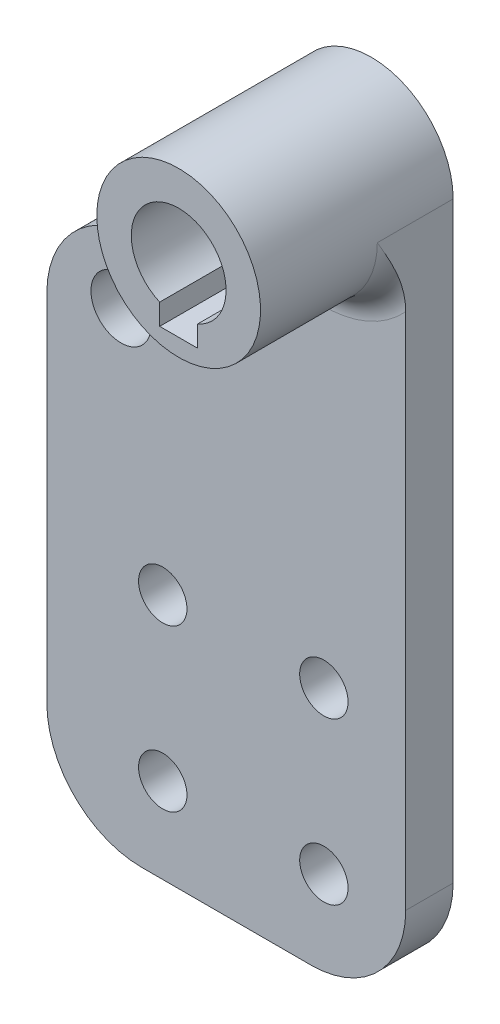
ISO-10303-21;
HEADER;
FILE_DESCRIPTION(('STEP AP214'),'2;1');
FILE_NAME('part.step','',(''),(''),'','','');
FILE_SCHEMA(('AUTOMOTIVE_DESIGN { 1 0 10303 214 1 1 1 1 }'));
ENDSEC;
DATA;
#1=APPLICATION_CONTEXT('core data for automotive mechanical design processes');
#2=APPLICATION_PROTOCOL_DEFINITION('international standard','automotive_design',2000,#1);
#3=PRODUCT_CONTEXT('',#1,'mechanical');
#4=PRODUCT('Part','Part','',(#3));
#5=PRODUCT_RELATED_PRODUCT_CATEGORY('part','',(#4));
#6=PRODUCT_DEFINITION_FORMATION('','',#4);
#7=PRODUCT_DEFINITION_CONTEXT('part definition',#1,'design');
#8=PRODUCT_DEFINITION('design','',#6,#7);
#9=PRODUCT_DEFINITION_SHAPE('','',#8);
#10=(LENGTH_UNIT() NAMED_UNIT(*) SI_UNIT(.MILLI.,.METRE.));
#11=(NAMED_UNIT(*) PLANE_ANGLE_UNIT() SI_UNIT($,.RADIAN.));
#12=(NAMED_UNIT(*) SI_UNIT($,.STERADIAN.) SOLID_ANGLE_UNIT());
#13=UNCERTAINTY_MEASURE_WITH_UNIT(LENGTH_MEASURE(1.E-05),#10,'distance_accuracy_value','');
#14=(GEOMETRIC_REPRESENTATION_CONTEXT(3) GLOBAL_UNCERTAINTY_ASSIGNED_CONTEXT((#13)) GLOBAL_UNIT_ASSIGNED_CONTEXT((#10,
#11,#12)) REPRESENTATION_CONTEXT('',''));
#15=CARTESIAN_POINT('',(0.,0.,0.));
#16=DIRECTION('',(0.,0.,1.));
#17=DIRECTION('',(1.,0.,0.));
#18=AXIS2_PLACEMENT_3D('',#15,#16,#17);
#19=CARTESIAN_POINT('',(-8.636,0.,-5.));
#20=DIRECTION('',(-1.,0.,0.));
#21=DIRECTION('',(0.,-1.,0.));
#22=AXIS2_PLACEMENT_3D('',#19,#20,#21);
#23=PLANE('',#22);
#24=DIRECTION('',(0.,-1.,0.));
#25=VECTOR('',#24,1.);
#26=CARTESIAN_POINT('',(-8.636,0.,-5.));
#27=LINE('',#26,#25);
#28=CARTESIAN_POINT('',(-8.636,0.,-5.));
#29=VERTEX_POINT('',#28);
#30=CARTESIAN_POINT('',(-8.636,-3.0273079091981,-5.));
#31=VERTEX_POINT('',#30);
#32=EDGE_CURVE('E205',#29,#31,#27,.T.);
#33=ORIENTED_EDGE('',*,*,#32,.T.);
#34=DIRECTION('',(0.,0.,1.));
#35=VECTOR('',#34,1.);
#36=CARTESIAN_POINT('',(-8.636,-3.0273079091981,-5.));
#37=LINE('',#36,#35);
#38=CARTESIAN_POINT('',(-8.636,-3.02730790919712,1.31894693533558));
#39=VERTEX_POINT('',#38);
#40=EDGE_CURVE('E304',#31,#39,#37,.T.);
#41=ORIENTED_EDGE('',*,*,#40,.T.);
#42=CARTESIAN_POINT('',(-8.636,-7.79846138670956,0.));
#43=CARTESIAN_POINT('',(-8.636,-7.68803290559079,3.496623452732E-06));
#44=CARTESIAN_POINT('',(-8.636,-7.57763296305611,0.00273825140363565));
#45=CARTESIAN_POINT('',(-8.636,-7.35711345915804,0.0133068635690326));
#46=CARTESIAN_POINT('',(-8.636,-7.24699381312745,0.0211389344820135));
#47=CARTESIAN_POINT('',(-8.636,-6.91776084465362,0.0516942592653301));
#48=CARTESIAN_POINT('',(-8.636,-6.69928284717616,0.0814798956054964));
#49=CARTESIAN_POINT('',(-8.636,-6.26844308966725,0.156703959217849));
#50=CARTESIAN_POINT('',(-8.636,-6.05603863345846,0.201905768123116));
#51=CARTESIAN_POINT('',(-8.636,-5.63447035283438,0.30583223029938));
#52=CARTESIAN_POINT('',(-8.636,-5.42530845727249,0.364564625952009));
#53=CARTESIAN_POINT('',(-8.636,-4.98768936449728,0.500654370668705));
#54=CARTESIAN_POINT('',(-8.636,-4.75965239042602,0.57935231142795));
#55=CARTESIAN_POINT('',(-8.636,-4.30795897403336,0.748524678717429));
#56=CARTESIAN_POINT('',(-8.636,-4.08430390071072,0.839002720172859));
#57=CARTESIAN_POINT('',(-8.636,-3.41921081985177,1.12497394654814));
#58=CARTESIAN_POINT('',(-8.636,-2.98399632606661,1.33488793982071));
#59=CARTESIAN_POINT('',(-8.636,-2.12328463049726,1.77982984912275));
#60=CARTESIAN_POINT('',(-8.636,-1.69787325232018,2.01501829438944));
#61=CARTESIAN_POINT('',(-8.636,-0.85362645777241,2.49697092229878));
#62=CARTESIAN_POINT('',(-8.636,-0.434792614578694,2.74373781958202));
#63=CARTESIAN_POINT('',(-8.636,-0.010674546716334,2.99370850774192));
#64=CARTESIAN_POINT('',(-8.636,-0.00533727245051437,2.99685425506038));
#65=CARTESIAN_POINT('',(-8.636,0.,3.));
#66=B_SPLINE_CURVE_WITH_KNOTS('',3,(#42,#43,#44,#45,#46,#47,#48,#49,#50,#51,#52,#53,#54,#55,#56,
#57,#58,#59,#60,#61,#62,#63,#64,#65),.UNSPECIFIED.,.F.,.F.,(4,2,2,2,2,2,2,2,2,2,2,4),(0.,
0.33120468942966,0.66229336298546,1.32300402431883,1.97399880271087,2.62536701829968,
3.34867354903378,4.07220256419407,5.52036657074905,6.97834303257521,8.43666305108041,
8.45524906732918),.UNSPECIFIED.);
#67=CARTESIAN_POINT('',(-8.636,0.,3.));
#68=VERTEX_POINT('',#67);
#69=EDGE_CURVE('E227',#39,#68,#66,.T.);
#70=ORIENTED_EDGE('',*,*,#69,.T.);
#71=DIRECTION('',(0.,0.,1.));
#72=VECTOR('',#71,1.);
#73=CARTESIAN_POINT('',(-8.636,0.,-5.));
#74=LINE('',#73,#72);
#75=EDGE_CURVE('E212',#29,#68,#74,.T.);
#76=ORIENTED_EDGE('',*,*,#75,.F.);
#77=EDGE_LOOP('',(#33,#41,#70,#76));
#78=FACE_BOUND('',#77,.T.);
#79=ADVANCED_FACE('F64',(#78),#23,.T.);
#80=CARTESIAN_POINT('',(0.,0.,20.));
#81=DIRECTION('',(0.,0.,-1.));
#82=DIRECTION('',(-1.,0.,0.));
#83=AXIS2_PLACEMENT_3D('',#80,#81,#82);
#84=CYLINDRICAL_SURFACE('',#83,8.636);
#85=CARTESIAN_POINT('',(0.,0.,15.32));
#86=DIRECTION('',(0.,0.,-1.));
#87=DIRECTION('',(-1.,0.,0.));
#88=AXIS2_PLACEMENT_3D('',#85,#86,#87);
#89=CIRCLE('',#88,8.636);
#90=CARTESIAN_POINT('',(-8.636,0.,15.32));
#91=VERTEX_POINT('',#90);
#92=EDGE_CURVE('E188',#91,#91,#89,.T.);
#93=ORIENTED_EDGE('',*,*,#92,.T.);
#94=EDGE_LOOP('',(#93));
#95=FACE_BOUND('',#94,.T.);
#96=ORIENTED_EDGE('',*,*,#75,.T.);
#97=CARTESIAN_POINT('',(0.,0.,3.));
#98=DIRECTION('',(0.,0.,1.));
#99=DIRECTION('',(1.,0.,0.));
#100=AXIS2_PLACEMENT_3D('',#97,#98,#99);
#101=CIRCLE('',#100,8.636);
#102=CARTESIAN_POINT('',(8.636,0.,3.));
#103=VERTEX_POINT('',#102);
#104=EDGE_CURVE('E224',#68,#103,#101,.T.);
#105=ORIENTED_EDGE('',*,*,#104,.T.);
#106=DIRECTION('',(0.,0.,1.));
#107=VECTOR('',#106,1.);
#108=CARTESIAN_POINT('',(8.636,0.,-5.));
#109=LINE('',#108,#107);
#110=CARTESIAN_POINT('',(8.636,0.,-5.));
#111=VERTEX_POINT('',#110);
#112=EDGE_CURVE('E216',#111,#103,#109,.T.);
#113=ORIENTED_EDGE('',*,*,#112,.F.);
#114=CARTESIAN_POINT('',(0.,0.,-5.));
#115=DIRECTION('',(0.,0.,1.));
#116=DIRECTION('',(1.,0.,0.));
#117=AXIS2_PLACEMENT_3D('',#114,#115,#116);
#118=CIRCLE('',#117,8.636);
#119=EDGE_CURVE('E204',#111,#29,#118,.T.);
#120=ORIENTED_EDGE('',*,*,#119,.T.);
#121=EDGE_LOOP('',(#96,#105,#113,#120));
#122=FACE_BOUND('',#121,.T.);
#123=ADVANCED_FACE('F249',(#95,#122),#84,.T.);
#124=CARTESIAN_POINT('',(0.,0.,20.));
#125=DIRECTION('',(0.,0.,-1.));
#126=DIRECTION('',(-1.,0.,0.));
#127=AXIS2_PLACEMENT_3D('',#124,#125,#126);
#128=CYLINDRICAL_SURFACE('',#127,5.);
#129=DIRECTION('',(0.,0.,-1.));
#130=VECTOR('',#129,1.);
#131=CARTESIAN_POINT('',(2.,-4.58257569495584,20.));
#132=LINE('',#131,#130);
#133=CARTESIAN_POINT('',(2.,-4.58257569495584,-5.));
#134=VERTEX_POINT('',#133);
#135=CARTESIAN_POINT('',(2.,-4.58257569495584,15.32));
#136=VERTEX_POINT('',#135);
#137=EDGE_CURVE('E201',#134,#136,#132,.F.);
#138=ORIENTED_EDGE('',*,*,#137,.T.);
#139=CARTESIAN_POINT('',(0.,0.,15.32));
#140=DIRECTION('',(0.,0.,-1.));
#141=DIRECTION('',(-1.,0.,0.));
#142=AXIS2_PLACEMENT_3D('',#139,#140,#141);
#143=CIRCLE('',#142,5.);
#144=CARTESIAN_POINT('',(-2.,-4.58257569495584,15.32));
#145=VERTEX_POINT('',#144);
#146=EDGE_CURVE('E419',#136,#145,#143,.F.);
#147=ORIENTED_EDGE('',*,*,#146,.T.);
#148=DIRECTION('',(0.,0.,-1.));
#149=VECTOR('',#148,1.);
#150=CARTESIAN_POINT('',(-2.,-4.58257569495584,20.));
#151=LINE('',#150,#149);
#152=CARTESIAN_POINT('',(-2.,-4.58257569495584,-5.));
#153=VERTEX_POINT('',#152);
#154=EDGE_CURVE('E187',#153,#145,#151,.F.);
#155=ORIENTED_EDGE('',*,*,#154,.F.);
#156=CARTESIAN_POINT('',(0.,0.,-5.));
#157=DIRECTION('',(0.,0.,1.));
#158=DIRECTION('',(1.,0.,0.));
#159=AXIS2_PLACEMENT_3D('',#156,#157,#158);
#160=CIRCLE('',#159,5.);
#161=EDGE_CURVE('E215',#134,#153,#160,.T.);
#162=ORIENTED_EDGE('',*,*,#161,.F.);
#163=EDGE_LOOP('',(#138,#147,#155,#162));
#164=FACE_BOUND('',#163,.T.);
#165=ADVANCED_FACE('F254',(#164),#128,.F.);
#166=CARTESIAN_POINT('',(8.636,0.,-5.));
#167=DIRECTION('',(-1.,0.,0.));
#168=DIRECTION('',(0.,-1.,0.));
#169=AXIS2_PLACEMENT_3D('',#166,#167,#168);
#170=PLANE('',#169);
#171=DIRECTION('',(0.,-1.,0.));
#172=VECTOR('',#171,1.);
#173=CARTESIAN_POINT('',(8.636,0.,0.));
#174=LINE('',#173,#172);
#175=CARTESIAN_POINT('',(8.636,-7.79846138670956,0.));
#176=VERTEX_POINT('',#175);
#177=CARTESIAN_POINT('',(8.63600000000001,-62.5,0.));
#178=VERTEX_POINT('',#177);
#179=EDGE_CURVE('E209',#176,#178,#174,.T.);
#180=ORIENTED_EDGE('',*,*,#179,.T.);
#181=DIRECTION('',(0.,0.,1.));
#182=VECTOR('',#181,1.);
#183=CARTESIAN_POINT('',(8.63600000000001,-62.5,-5.));
#184=LINE('',#183,#182);
#185=CARTESIAN_POINT('',(8.63600000000001,-62.5,-5.));
#186=VERTEX_POINT('',#185);
#187=EDGE_CURVE('E296',#178,#186,#184,.F.);
#188=ORIENTED_EDGE('',*,*,#187,.T.);
#189=DIRECTION('',(0.,-1.,0.));
#190=VECTOR('',#189,1.);
#191=CARTESIAN_POINT('',(8.636,0.,-5.));
#192=LINE('',#191,#190);
#193=EDGE_CURVE('E208',#111,#186,#192,.T.);
#194=ORIENTED_EDGE('',*,*,#193,.F.);
#195=ORIENTED_EDGE('',*,*,#112,.T.);
#196=CARTESIAN_POINT('',(8.636,-7.79846138670956,0.));
#197=CARTESIAN_POINT('',(8.636,-7.68803290559079,3.496623452732E-06));
#198=CARTESIAN_POINT('',(8.636,-7.57763296305611,0.00273825140363565));
#199=CARTESIAN_POINT('',(8.636,-7.35711345915804,0.0133068635690326));
#200=CARTESIAN_POINT('',(8.636,-7.24699381312745,0.0211389344820135));
#201=CARTESIAN_POINT('',(8.636,-6.91776084465362,0.0516942592653301));
#202=CARTESIAN_POINT('',(8.636,-6.69928284717616,0.0814798956054964));
#203=CARTESIAN_POINT('',(8.636,-6.26844308966725,0.156703959217849));
#204=CARTESIAN_POINT('',(8.636,-6.05603863345846,0.201905768123116));
#205=CARTESIAN_POINT('',(8.636,-5.63447035283438,0.30583223029938));
#206=CARTESIAN_POINT('',(8.636,-5.42530845727249,0.364564625952009));
#207=CARTESIAN_POINT('',(8.636,-4.98768936449728,0.500654370668705));
#208=CARTESIAN_POINT('',(8.636,-4.75965239042602,0.57935231142795));
#209=CARTESIAN_POINT('',(8.636,-4.30795897403336,0.748524678717429));
#210=CARTESIAN_POINT('',(8.636,-4.08430390071072,0.839002720172859));
#211=CARTESIAN_POINT('',(8.636,-3.41921081985177,1.12497394654814));
#212=CARTESIAN_POINT('',(8.636,-2.98399632606661,1.33488793982071));
#213=CARTESIAN_POINT('',(8.636,-2.12328463049726,1.77982984912275));
#214=CARTESIAN_POINT('',(8.636,-1.69787325232018,2.01501829438944));
#215=CARTESIAN_POINT('',(8.636,-0.85362645777241,2.49697092229878));
#216=CARTESIAN_POINT('',(8.636,-0.434792614578694,2.74373781958202));
#217=CARTESIAN_POINT('',(8.636,-0.010674546716334,2.99370850774192));
#218=CARTESIAN_POINT('',(8.636,-0.00533727245051437,2.99685425506038));
#219=CARTESIAN_POINT('',(8.636,0.,3.));
#220=B_SPLINE_CURVE_WITH_KNOTS('',3,(#196,#197,#198,#199,#200,#201,#202,#203,#204,#205,#206,
#207,#208,#209,#210,#211,#212,#213,#214,#215,#216,#217,#218,#219),.UNSPECIFIED.,.F.,.F.,(4,2,2,
2,2,2,2,2,2,2,2,4),(0.,0.33120468942966,0.66229336298546,1.32300402431883,1.97399880271087,
2.62536701829968,3.34867354903378,4.07220256419407,5.52036657074905,6.97834303257521,
8.43666305108041,8.45524906732918),.UNSPECIFIED.);
#221=EDGE_CURVE('E235',#103,#176,#220,.F.);
#222=ORIENTED_EDGE('',*,*,#221,.T.);
#223=EDGE_LOOP('',(#180,#188,#194,#195,#222));
#224=FACE_BOUND('',#223,.T.);
#225=ADVANCED_FACE('F251',(#224),#170,.F.);
#226=CARTESIAN_POINT('',(0.,0.,-5.));
#227=DIRECTION('',(0.,0.,1.));
#228=DIRECTION('',(1.,0.,0.));
#229=AXIS2_PLACEMENT_3D('',#226,#227,#228);
#230=PLANE('',#229);
#231=CARTESIAN_POINT('',(-21.4,-22.5,-5.));
#232=DIRECTION('',(0.,0.,1.));
#233=DIRECTION('',(1.,0.,0.));
#234=AXIS2_PLACEMENT_3D('',#231,#232,#233);
#235=CIRCLE('',#234,3.175);
#236=CARTESIAN_POINT('',(-18.225,-22.5,-5.));
#237=VERTEX_POINT('',#236);
#238=EDGE_CURVE('E385',#237,#237,#235,.F.);
#239=ORIENTED_EDGE('',*,*,#238,.F.);
#240=EDGE_LOOP('',(#239));
#241=FACE_BOUND('',#240,.T.);
#242=CARTESIAN_POINT('',(-17.,-46.5,-5.));
#243=DIRECTION('',(0.,0.,1.));
#244=DIRECTION('',(1.,0.,0.));
#245=AXIS2_PLACEMENT_3D('',#242,#243,#244);
#246=CIRCLE('',#245,2.5527);
#247=CARTESIAN_POINT('',(-14.4473,-46.5,-5.));
#248=VERTEX_POINT('',#247);
#249=EDGE_CURVE('E393',#248,#248,#246,.T.);
#250=ORIENTED_EDGE('',*,*,#249,.T.);
#251=EDGE_LOOP('',(#250));
#252=FACE_BOUND('',#251,.T.);
#253=CARTESIAN_POINT('',(0.,-46.5,-5.));
#254=DIRECTION('',(0.,0.,1.));
#255=DIRECTION('',(1.,0.,0.));
#256=AXIS2_PLACEMENT_3D('',#253,#254,#255);
#257=CIRCLE('',#256,2.5527);
#258=CARTESIAN_POINT('',(2.55270000000001,-46.5,-5.));
#259=VERTEX_POINT('',#258);
#260=EDGE_CURVE('E399',#259,#259,#257,.T.);
#261=ORIENTED_EDGE('',*,*,#260,.T.);
#262=EDGE_LOOP('',(#261));
#263=FACE_BOUND('',#262,.T.);
#264=CARTESIAN_POINT('',(-17.,-63.5,-5.));
#265=DIRECTION('',(0.,0.,1.));
#266=DIRECTION('',(1.,0.,0.));
#267=AXIS2_PLACEMENT_3D('',#264,#265,#266);
#268=CIRCLE('',#267,2.5527);
#269=CARTESIAN_POINT('',(-14.4473,-63.5,-5.));
#270=VERTEX_POINT('',#269);
#271=EDGE_CURVE('E405',#270,#270,#268,.T.);
#272=ORIENTED_EDGE('',*,*,#271,.T.);
#273=EDGE_LOOP('',(#272));
#274=FACE_BOUND('',#273,.T.);
#275=CARTESIAN_POINT('',(0.,-63.5,-5.));
#276=DIRECTION('',(0.,0.,1.));
#277=DIRECTION('',(1.,0.,0.));
#278=AXIS2_PLACEMENT_3D('',#275,#276,#277);
#279=CIRCLE('',#278,2.5527);
#280=CARTESIAN_POINT('',(2.55270000000001,-63.5,-5.));
#281=VERTEX_POINT('',#280);
#282=EDGE_CURVE('E411',#281,#281,#279,.T.);
#283=ORIENTED_EDGE('',*,*,#282,.T.);
#284=EDGE_LOOP('',(#283));
#285=FACE_BOUND('',#284,.T.);
#286=DIRECTION('',(-1.,0.,0.));
#287=VECTOR('',#286,1.);
#288=CARTESIAN_POINT('',(0.,-6.79999999999994,-5.));
#289=LINE('',#288,#287);
#290=CARTESIAN_POINT('',(2.,-6.79999999999993,-5.));
#291=VERTEX_POINT('',#290);
#292=CARTESIAN_POINT('',(-1.99999999999999,-6.79999999999994,-5.));
#293=VERTEX_POINT('',#292);
#294=EDGE_CURVE('E192',#291,#293,#289,.T.);
#295=ORIENTED_EDGE('',*,*,#294,.F.);
#296=DIRECTION('',(0.,1.,0.));
#297=VECTOR('',#296,1.);
#298=CARTESIAN_POINT('',(2.,0.,-5.));
#299=LINE('',#298,#297);
#300=EDGE_CURVE('E414',#291,#134,#299,.T.);
#301=ORIENTED_EDGE('',*,*,#300,.T.);
#302=ORIENTED_EDGE('',*,*,#161,.T.);
#303=DIRECTION('',(0.,1.,0.));
#304=VECTOR('',#303,1.);
#305=CARTESIAN_POINT('',(-2.,0.,-5.));
#306=LINE('',#305,#304);
#307=EDGE_CURVE('E197',#293,#153,#306,.T.);
#308=ORIENTED_EDGE('',*,*,#307,.F.);
#309=EDGE_LOOP('',(#295,#301,#302,#308));
#310=FACE_BOUND('',#309,.T.);
#311=DIRECTION('',(0.,1.,0.));
#312=VECTOR('',#311,1.);
#313=CARTESIAN_POINT('',(-29.2250526436834,0.,-5.));
#314=LINE('',#313,#312);
#315=CARTESIAN_POINT('',(-29.2250526436834,-62.5,-5.));
#316=VERTEX_POINT('',#315);
#317=CARTESIAN_POINT('',(-29.2250526436834,-25.,-5.));
#318=VERTEX_POINT('',#317);
#319=EDGE_CURVE('E383',#316,#318,#314,.T.);
#320=ORIENTED_EDGE('',*,*,#319,.T.);
#321=CARTESIAN_POINT('',(-19.2250526436834,-25.,-5.));
#322=DIRECTION('',(0.,0.,1.));
#323=DIRECTION('',(1.,0.,0.));
#324=AXIS2_PLACEMENT_3D('',#321,#322,#323);
#325=CIRCLE('',#324,10.);
#326=CARTESIAN_POINT('',(-20.2110469517617,-15.0487279594799,-5.));
#327=VERTEX_POINT('',#326);
#328=EDGE_CURVE('E288',#318,#327,#325,.F.);
#329=ORIENTED_EDGE('',*,*,#328,.T.);
#330=CARTESIAN_POINT('',(-20.680626740984,-10.3094346501822,-5.));
#331=DIRECTION('',(0.,0.,1.));
#332=DIRECTION('',(1.,0.,0.));
#333=AXIS2_PLACEMENT_3D('',#330,#331,#332);
#334=CIRCLE('',#333,4.7625);
#335=CARTESIAN_POINT('',(-17.3130306955831,-13.6770306955831,-5.));
#336=VERTEX_POINT('',#335);
#337=EDGE_CURVE('E354',#327,#336,#334,.T.);
#338=ORIENTED_EDGE('',*,*,#337,.T.);
#339=DIRECTION('',(0.707106781186544,0.707106781186551,0.));
#340=VECTOR('',#339,1.);
#341=CARTESIAN_POINT('',(-1.81800000000007,1.81800000000005,-5.));
#342=LINE('',#341,#340);
#343=CARTESIAN_POINT('',(-10.030903954599,-6.39490395459902,-5.));
#344=VERTEX_POINT('',#343);
#345=EDGE_CURVE('E301',#336,#344,#342,.T.);
#346=ORIENTED_EDGE('',*,*,#345,.T.);
#347=CARTESIAN_POINT('',(-13.3985,-3.0273079091981,-5.));
#348=DIRECTION('',(0.,0.,1.));
#349=DIRECTION('',(1.,0.,0.));
#350=AXIS2_PLACEMENT_3D('',#347,#348,#349);
#351=CIRCLE('',#350,4.7625);
#352=EDGE_CURVE('E357',#344,#31,#351,.T.);
#353=ORIENTED_EDGE('',*,*,#352,.T.);
#354=ORIENTED_EDGE('',*,*,#32,.F.);
#355=ORIENTED_EDGE('',*,*,#119,.F.);
#356=ORIENTED_EDGE('',*,*,#193,.T.);
#357=CARTESIAN_POINT('',(-1.36399999999999,-62.5,-5.));
#358=DIRECTION('',(0.,0.,1.));
#359=DIRECTION('',(1.,0.,0.));
#360=AXIS2_PLACEMENT_3D('',#357,#358,#359);
#361=CIRCLE('',#360,10.);
#362=CARTESIAN_POINT('',(-1.36399999999999,-72.5,-5.));
#363=VERTEX_POINT('',#362);
#364=EDGE_CURVE('E284',#186,#363,#361,.F.);
#365=ORIENTED_EDGE('',*,*,#364,.T.);
#366=DIRECTION('',(1.,0.,0.));
#367=VECTOR('',#366,1.);
#368=CARTESIAN_POINT('',(0.,-72.5,-5.));
#369=LINE('',#368,#367);
#370=CARTESIAN_POINT('',(-19.2250526436834,-72.5,-5.));
#371=VERTEX_POINT('',#370);
#372=EDGE_CURVE('E374',#371,#363,#369,.T.);
#373=ORIENTED_EDGE('',*,*,#372,.F.);
#374=CARTESIAN_POINT('',(-19.2250526436834,-62.5,-5.));
#375=DIRECTION('',(0.,0.,1.));
#376=DIRECTION('',(1.,0.,0.));
#377=AXIS2_PLACEMENT_3D('',#374,#375,#376);
#378=CIRCLE('',#377,10.);
#379=EDGE_CURVE('E286',#371,#316,#378,.F.);
#380=ORIENTED_EDGE('',*,*,#379,.T.);
#381=EDGE_LOOP('',(#320,#329,#338,#346,#353,#354,#355,#356,#365,#373,#380));
#382=FACE_BOUND('',#381,.T.);
#383=ADVANCED_FACE('F367',(#241,#252,#263,#274,#285,#310,#382),#230,.F.);
#384=CARTESIAN_POINT('',(0.,0.,0.));
#385=DIRECTION('',(0.,0.,1.));
#386=DIRECTION('',(1.,0.,0.));
#387=AXIS2_PLACEMENT_3D('',#384,#385,#386);
#388=PLANE('',#387);
#389=CARTESIAN_POINT('',(-21.4,-22.5,0.));
#390=DIRECTION('',(0.,0.,1.));
#391=DIRECTION('',(1.,0.,0.));
#392=AXIS2_PLACEMENT_3D('',#389,#390,#391);
#393=CIRCLE('',#392,3.175);
#394=CARTESIAN_POINT('',(-18.225,-22.5,0.));
#395=VERTEX_POINT('',#394);
#396=EDGE_CURVE('E424',#395,#395,#393,.T.);
#397=ORIENTED_EDGE('',*,*,#396,.F.);
#398=EDGE_LOOP('',(#397));
#399=FACE_BOUND('',#398,.T.);
#400=DIRECTION('',(-0.707106781186544,-0.707106781186551,0.));
#401=VECTOR('',#400,1.);
#402=CARTESIAN_POINT('',(-8.636,-4.99999999999995,0.));
#403=LINE('',#402,#401);
#404=CARTESIAN_POINT('',(-10.030903954599,-6.39490395459902,0.));
#405=VERTEX_POINT('',#404);
#406=CARTESIAN_POINT('',(-17.3130306955831,-13.6770306955831,0.));
#407=VERTEX_POINT('',#406);
#408=EDGE_CURVE('E298',#405,#407,#403,.T.);
#409=ORIENTED_EDGE('',*,*,#408,.T.);
#410=CARTESIAN_POINT('',(-20.680626740984,-10.3094346501822,0.));
#411=DIRECTION('',(0.,0.,1.));
#412=DIRECTION('',(1.,0.,0.));
#413=AXIS2_PLACEMENT_3D('',#410,#411,#412);
#414=CIRCLE('',#413,4.7625);
#415=CARTESIAN_POINT('',(-20.2110469517617,-15.0487279594799,0.));
#416=VERTEX_POINT('',#415);
#417=EDGE_CURVE('E72',#407,#416,#414,.F.);
#418=ORIENTED_EDGE('',*,*,#417,.T.);
#419=CARTESIAN_POINT('',(-19.2250526436834,-25.,0.));
#420=DIRECTION('',(0.,0.,1.));
#421=DIRECTION('',(1.,0.,0.));
#422=AXIS2_PLACEMENT_3D('',#419,#420,#421);
#423=CIRCLE('',#422,10.);
#424=CARTESIAN_POINT('',(-29.2250526436834,-25.,0.));
#425=VERTEX_POINT('',#424);
#426=EDGE_CURVE('E275',#416,#425,#423,.T.);
#427=ORIENTED_EDGE('',*,*,#426,.T.);
#428=DIRECTION('',(0.,-1.,0.));
#429=VECTOR('',#428,1.);
#430=CARTESIAN_POINT('',(-29.2250526436834,0.,0.));
#431=LINE('',#430,#429);
#432=CARTESIAN_POINT('',(-29.2250526436834,-62.5,0.));
#433=VERTEX_POINT('',#432);
#434=EDGE_CURVE('E380',#425,#433,#431,.T.);
#435=ORIENTED_EDGE('',*,*,#434,.T.);
#436=CARTESIAN_POINT('',(-19.2250526436834,-62.5,0.));
#437=DIRECTION('',(0.,0.,1.));
#438=DIRECTION('',(1.,0.,0.));
#439=AXIS2_PLACEMENT_3D('',#436,#437,#438);
#440=CIRCLE('',#439,10.);
#441=CARTESIAN_POINT('',(-19.2250526436834,-72.5,0.));
#442=VERTEX_POINT('',#441);
#443=EDGE_CURVE('E273',#433,#442,#440,.T.);
#444=ORIENTED_EDGE('',*,*,#443,.T.);
#445=DIRECTION('',(-1.,0.,0.));
#446=VECTOR('',#445,1.);
#447=CARTESIAN_POINT('',(0.,-72.5,0.));
#448=LINE('',#447,#446);
#449=CARTESIAN_POINT('',(-1.36399999999999,-72.5,0.));
#450=VERTEX_POINT('',#449);
#451=EDGE_CURVE('E381',#450,#442,#448,.T.);
#452=ORIENTED_EDGE('',*,*,#451,.F.);
#453=CARTESIAN_POINT('',(-1.36399999999999,-62.5,0.));
#454=DIRECTION('',(0.,0.,1.));
#455=DIRECTION('',(1.,0.,0.));
#456=AXIS2_PLACEMENT_3D('',#453,#454,#455);
#457=CIRCLE('',#456,10.);
#458=EDGE_CURVE('E272',#450,#178,#457,.T.);
#459=ORIENTED_EDGE('',*,*,#458,.T.);
#460=ORIENTED_EDGE('',*,*,#179,.F.);
#461=CARTESIAN_POINT('',(0.,0.,0.));
#462=DIRECTION('',(0.,0.,1.));
#463=DIRECTION('',(1.,0.,0.));
#464=AXIS2_PLACEMENT_3D('',#461,#462,#463);
#465=CIRCLE('',#464,11.636);
#466=CARTESIAN_POINT('',(-9.84666146176818,-6.19998016588193,0.));
#467=VERTEX_POINT('',#466);
#468=EDGE_CURVE('E86',#176,#467,#465,.F.);
#469=ORIENTED_EDGE('',*,*,#468,.T.);
#470=CARTESIAN_POINT('',(-13.3985,-3.0273079091981,0.));
#471=DIRECTION('',(0.,0.,1.));
#472=DIRECTION('',(1.,0.,0.));
#473=AXIS2_PLACEMENT_3D('',#470,#471,#472);
#474=CIRCLE('',#473,4.7625);
#475=EDGE_CURVE('E320',#467,#405,#474,.F.);
#476=ORIENTED_EDGE('',*,*,#475,.T.);
#477=EDGE_LOOP('',(#409,#418,#427,#435,#444,#452,#459,#460,#469,#476));
#478=FACE_BOUND('',#477,.T.);
#479=CARTESIAN_POINT('',(-17.,-46.5,0.));
#480=DIRECTION('',(0.,0.,1.));
#481=DIRECTION('',(1.,0.,0.));
#482=AXIS2_PLACEMENT_3D('',#479,#480,#481);
#483=CIRCLE('',#482,2.5527);
#484=CARTESIAN_POINT('',(-14.4473,-46.5,0.));
#485=VERTEX_POINT('',#484);
#486=EDGE_CURVE('E390',#485,#485,#483,.T.);
#487=ORIENTED_EDGE('',*,*,#486,.F.);
#488=EDGE_LOOP('',(#487));
#489=FACE_BOUND('',#488,.T.);
#490=CARTESIAN_POINT('',(0.,-46.5,0.));
#491=DIRECTION('',(0.,0.,1.));
#492=DIRECTION('',(1.,0.,0.));
#493=AXIS2_PLACEMENT_3D('',#490,#491,#492);
#494=CIRCLE('',#493,2.5527);
#495=CARTESIAN_POINT('',(2.55270000000001,-46.5,0.));
#496=VERTEX_POINT('',#495);
#497=EDGE_CURVE('E396',#496,#496,#494,.T.);
#498=ORIENTED_EDGE('',*,*,#497,.F.);
#499=EDGE_LOOP('',(#498));
#500=FACE_BOUND('',#499,.T.);
#501=CARTESIAN_POINT('',(-17.,-63.5,0.));
#502=DIRECTION('',(0.,0.,1.));
#503=DIRECTION('',(1.,0.,0.));
#504=AXIS2_PLACEMENT_3D('',#501,#502,#503);
#505=CIRCLE('',#504,2.5527);
#506=CARTESIAN_POINT('',(-14.4473,-63.5,0.));
#507=VERTEX_POINT('',#506);
#508=EDGE_CURVE('E402',#507,#507,#505,.T.);
#509=ORIENTED_EDGE('',*,*,#508,.F.);
#510=EDGE_LOOP('',(#509));
#511=FACE_BOUND('',#510,.T.);
#512=CARTESIAN_POINT('',(0.,-63.5,0.));
#513=DIRECTION('',(0.,0.,1.));
#514=DIRECTION('',(1.,0.,0.));
#515=AXIS2_PLACEMENT_3D('',#512,#513,#514);
#516=CIRCLE('',#515,2.5527);
#517=CARTESIAN_POINT('',(2.55270000000001,-63.5,0.));
#518=VERTEX_POINT('',#517);
#519=EDGE_CURVE('E408',#518,#518,#516,.T.);
#520=ORIENTED_EDGE('',*,*,#519,.F.);
#521=EDGE_LOOP('',(#520));
#522=FACE_BOUND('',#521,.T.);
#523=ADVANCED_FACE('F362',(#399,#478,#489,#500,#511,#522),#388,.T.);
#524=CARTESIAN_POINT('',(2.,0.,-5.));
#525=DIRECTION('',(1.,0.,0.));
#526=DIRECTION('',(0.,1.,0.));
#527=AXIS2_PLACEMENT_3D('',#524,#525,#526);
#528=PLANE('',#527);
#529=DIRECTION('',(0.,0.,1.));
#530=VECTOR('',#529,1.);
#531=CARTESIAN_POINT('',(2.,-6.79999999999993,-5.));
#532=LINE('',#531,#530);
#533=CARTESIAN_POINT('',(2.,-6.79999999999993,15.32));
#534=VERTEX_POINT('',#533);
#535=EDGE_CURVE('E194',#291,#534,#532,.T.);
#536=ORIENTED_EDGE('',*,*,#535,.T.);
#537=DIRECTION('',(0.,1.,0.));
#538=VECTOR('',#537,1.);
#539=CARTESIAN_POINT('',(2.,0.,15.32));
#540=LINE('',#539,#538);
#541=EDGE_CURVE('E78',#534,#136,#540,.T.);
#542=ORIENTED_EDGE('',*,*,#541,.T.);
#543=ORIENTED_EDGE('',*,*,#137,.F.);
#544=ORIENTED_EDGE('',*,*,#300,.F.);
#545=EDGE_LOOP('',(#536,#542,#543,#544));
#546=FACE_BOUND('',#545,.T.);
#547=ADVANCED_FACE('F422',(#546),#528,.F.);
#548=CARTESIAN_POINT('',(-2.,0.,-5.));
#549=DIRECTION('',(1.,0.,0.));
#550=DIRECTION('',(0.,1.,0.));
#551=AXIS2_PLACEMENT_3D('',#548,#549,#550);
#552=PLANE('',#551);
#553=DIRECTION('',(0.,1.,0.));
#554=VECTOR('',#553,1.);
#555=CARTESIAN_POINT('',(-2.,0.,15.32));
#556=LINE('',#555,#554);
#557=CARTESIAN_POINT('',(-2.,-6.79999999999994,15.32));
#558=VERTEX_POINT('',#557);
#559=EDGE_CURVE('E176',#558,#145,#556,.T.);
#560=ORIENTED_EDGE('',*,*,#559,.F.);
#561=DIRECTION('',(0.,0.,1.));
#562=VECTOR('',#561,1.);
#563=CARTESIAN_POINT('',(-2.,-6.79999999999994,-5.));
#564=LINE('',#563,#562);
#565=EDGE_CURVE('E184',#293,#558,#564,.T.);
#566=ORIENTED_EDGE('',*,*,#565,.F.);
#567=ORIENTED_EDGE('',*,*,#307,.T.);
#568=ORIENTED_EDGE('',*,*,#154,.T.);
#569=EDGE_LOOP('',(#560,#566,#567,#568));
#570=FACE_BOUND('',#569,.T.);
#571=ADVANCED_FACE('F183',(#570),#552,.T.);
#572=CARTESIAN_POINT('',(0.,-6.79999999999994,-5.));
#573=DIRECTION('',(0.,1.,0.));
#574=DIRECTION('',(-1.,0.,0.));
#575=AXIS2_PLACEMENT_3D('',#572,#573,#574);
#576=PLANE('',#575);
#577=DIRECTION('',(-1.,0.,0.));
#578=VECTOR('',#577,1.);
#579=CARTESIAN_POINT('',(0.,-6.79999999999994,15.32));
#580=LINE('',#579,#578);
#581=EDGE_CURVE('E12',#534,#558,#580,.T.);
#582=ORIENTED_EDGE('',*,*,#581,.F.);
#583=ORIENTED_EDGE('',*,*,#535,.F.);
#584=ORIENTED_EDGE('',*,*,#294,.T.);
#585=ORIENTED_EDGE('',*,*,#565,.T.);
#586=EDGE_LOOP('',(#582,#583,#584,#585));
#587=FACE_BOUND('',#586,.T.);
#588=ADVANCED_FACE('F190',(#587),#576,.T.);
#589=CARTESIAN_POINT('',(0.,-63.5,0.));
#590=DIRECTION('',(0.,0.,1.));
#591=DIRECTION('',(1.,0.,0.));
#592=AXIS2_PLACEMENT_3D('',#589,#590,#591);
#593=CYLINDRICAL_SURFACE('',#592,2.5527);
#594=ORIENTED_EDGE('',*,*,#282,.F.);
#595=EDGE_LOOP('',(#594));
#596=FACE_BOUND('',#595,.T.);
#597=ORIENTED_EDGE('',*,*,#519,.T.);
#598=EDGE_LOOP('',(#597));
#599=FACE_BOUND('',#598,.T.);
#600=ADVANCED_FACE('F446',(#596,#599),#593,.F.);
#601=CARTESIAN_POINT('',(-17.,-63.5,0.));
#602=DIRECTION('',(0.,0.,1.));
#603=DIRECTION('',(1.,0.,0.));
#604=AXIS2_PLACEMENT_3D('',#601,#602,#603);
#605=CYLINDRICAL_SURFACE('',#604,2.5527);
#606=ORIENTED_EDGE('',*,*,#271,.F.);
#607=EDGE_LOOP('',(#606));
#608=FACE_BOUND('',#607,.T.);
#609=ORIENTED_EDGE('',*,*,#508,.T.);
#610=EDGE_LOOP('',(#609));
#611=FACE_BOUND('',#610,.T.);
#612=ADVANCED_FACE('F449',(#608,#611),#605,.F.);
#613=CARTESIAN_POINT('',(0.,-46.5,0.));
#614=DIRECTION('',(0.,0.,1.));
#615=DIRECTION('',(1.,0.,0.));
#616=AXIS2_PLACEMENT_3D('',#613,#614,#615);
#617=CYLINDRICAL_SURFACE('',#616,2.5527);
#618=ORIENTED_EDGE('',*,*,#260,.F.);
#619=EDGE_LOOP('',(#618));
#620=FACE_BOUND('',#619,.T.);
#621=ORIENTED_EDGE('',*,*,#497,.T.);
#622=EDGE_LOOP('',(#621));
#623=FACE_BOUND('',#622,.T.);
#624=ADVANCED_FACE('F453',(#620,#623),#617,.F.);
#625=CARTESIAN_POINT('',(-17.,-46.5,0.));
#626=DIRECTION('',(0.,0.,1.));
#627=DIRECTION('',(1.,0.,0.));
#628=AXIS2_PLACEMENT_3D('',#625,#626,#627);
#629=CYLINDRICAL_SURFACE('',#628,2.5527);
#630=ORIENTED_EDGE('',*,*,#249,.F.);
#631=EDGE_LOOP('',(#630));
#632=FACE_BOUND('',#631,.T.);
#633=ORIENTED_EDGE('',*,*,#486,.T.);
#634=EDGE_LOOP('',(#633));
#635=FACE_BOUND('',#634,.T.);
#636=ADVANCED_FACE('F457',(#632,#635),#629,.F.);
#637=CARTESIAN_POINT('',(-29.2250526436834,0.,-65.2597503268464));
#638=DIRECTION('',(-1.,0.,0.));
#639=DIRECTION('',(0.,0.,1.));
#640=AXIS2_PLACEMENT_3D('',#637,#638,#639);
#641=PLANE('',#640);
#642=ORIENTED_EDGE('',*,*,#434,.F.);
#643=DIRECTION('',(0.,0.,1.));
#644=VECTOR('',#643,1.);
#645=CARTESIAN_POINT('',(-29.2250526436834,-25.,-5.));
#646=LINE('',#645,#644);
#647=EDGE_CURVE('E282',#425,#318,#646,.F.);
#648=ORIENTED_EDGE('',*,*,#647,.T.);
#649=ORIENTED_EDGE('',*,*,#319,.F.);
#650=DIRECTION('',(0.,0.,1.));
#651=VECTOR('',#650,1.);
#652=CARTESIAN_POINT('',(-29.2250526436834,-62.5,0.));
#653=LINE('',#652,#651);
#654=EDGE_CURVE('E279',#316,#433,#653,.T.);
#655=ORIENTED_EDGE('',*,*,#654,.T.);
#656=EDGE_LOOP('',(#642,#648,#649,#655));
#657=FACE_BOUND('',#656,.T.);
#658=ADVANCED_FACE('F461',(#657),#641,.T.);
#659=CARTESIAN_POINT('',(0.,-72.5,-84.9643100801743));
#660=DIRECTION('',(0.,1.,0.));
#661=DIRECTION('',(0.,0.,1.));
#662=AXIS2_PLACEMENT_3D('',#659,#660,#661);
#663=PLANE('',#662);
#664=ORIENTED_EDGE('',*,*,#451,.T.);
#665=DIRECTION('',(0.,0.,1.));
#666=VECTOR('',#665,1.);
#667=CARTESIAN_POINT('',(-19.2250526436834,-72.5,-5.));
#668=LINE('',#667,#666);
#669=EDGE_CURVE('E294',#442,#371,#668,.F.);
#670=ORIENTED_EDGE('',*,*,#669,.T.);
#671=ORIENTED_EDGE('',*,*,#372,.T.);
#672=DIRECTION('',(0.,0.,1.));
#673=VECTOR('',#672,1.);
#674=CARTESIAN_POINT('',(-1.36399999999999,-72.5,-84.9643100801743));
#675=LINE('',#674,#673);
#676=EDGE_CURVE('E291',#363,#450,#675,.T.);
#677=ORIENTED_EDGE('',*,*,#676,.T.);
#678=EDGE_LOOP('',(#664,#670,#671,#677));
#679=FACE_BOUND('',#678,.T.);
#680=ADVANCED_FACE('F378',(#679),#663,.F.);
#681=CARTESIAN_POINT('',(-21.4,-22.5,-13.9802561210692));
#682=DIRECTION('',(0.,0.,1.));
#683=DIRECTION('',(1.,0.,0.));
#684=AXIS2_PLACEMENT_3D('',#681,#682,#683);
#685=CYLINDRICAL_SURFACE('',#684,3.175);
#686=ORIENTED_EDGE('',*,*,#238,.T.);
#687=EDGE_LOOP('',(#686));
#688=FACE_BOUND('',#687,.T.);
#689=ORIENTED_EDGE('',*,*,#396,.T.);
#690=EDGE_LOOP('',(#689));
#691=FACE_BOUND('',#690,.T.);
#692=ADVANCED_FACE('F344',(#688,#691),#685,.F.);
#693=CARTESIAN_POINT('',(0.,0.,3.));
#694=DIRECTION('',(0.,0.,1.));
#695=DIRECTION('',(1.,0.,0.));
#696=AXIS2_PLACEMENT_3D('',#693,#694,#695);
#697=TOROIDAL_SURFACE('',#696,11.636,3.);
#698=ORIENTED_EDGE('',*,*,#221,.F.);
#699=ORIENTED_EDGE('',*,*,#104,.F.);
#700=ORIENTED_EDGE('',*,*,#69,.F.);
#701=CARTESIAN_POINT('',(-8.636,-3.0273079091981,1.31894693533558));
#702=CARTESIAN_POINT('',(-8.63601577848176,-3.10056216491775,1.28306157084259));
#703=CARTESIAN_POINT('',(-8.63769059888725,-3.17310715045185,1.24581039130635));
#704=CARTESIAN_POINT('',(-8.64427563718974,-3.31712024534046,1.1695978689563));
#705=CARTESIAN_POINT('',(-8.64918482376713,-3.38858869053604,1.13063707497028));
#706=CARTESIAN_POINT('',(-8.66217620541865,-3.53105793256598,1.05188027635915));
#707=CARTESIAN_POINT('',(-8.67026822722655,-3.60205658197574,1.01208204989971));
#708=CARTESIAN_POINT('',(-8.68963534995726,-3.7436193105058,0.932483210276783));
#709=CARTESIAN_POINT('',(-8.70091071328415,-3.81418335331113,0.892682597187086));
#710=CARTESIAN_POINT('',(-8.74017050245716,-4.02874248623741,0.772410813615655));
#711=CARTESIAN_POINT('',(-8.7733005334103,-4.17238955363424,0.692916969331905));
#712=CARTESIAN_POINT('',(-8.85393007380916,-4.45923121099852,0.541067418642211));
#713=CARTESIAN_POINT('',(-8.90140531706443,-4.60242615563126,0.468699929363533));
#714=CARTESIAN_POINT('',(-8.987348826614,-4.82463809371536,0.364789668346845));
#715=CARTESIAN_POINT('',(-9.0204637919545,-4.90393390873425,0.329382237651883));
#716=CARTESIAN_POINT('',(-9.09168752457473,-5.06207914689983,0.262752009733323));
#717=CARTESIAN_POINT('',(-9.12979698837221,-5.14092850618222,0.231529797398452));
#718=CARTESIAN_POINT('',(-9.21074738903278,-5.29706319073518,0.174323578766134));
#719=CARTESIAN_POINT('',(-9.25353967746686,-5.37435626113525,0.148292406043058));
#720=CARTESIAN_POINT('',(-9.34415762850921,-5.52763620138714,0.101868718119881));
#721=CARTESIAN_POINT('',(-9.39198123651894,-5.60362358979578,0.0814739134877559));
#722=CARTESIAN_POINT('',(-9.50259347726372,-5.76866207491272,0.0436430594409963));
#723=CARTESIAN_POINT('',(-9.56646996806041,-5.85731931966921,0.0275933452795169));
#724=CARTESIAN_POINT('',(-9.66752486334872,-5.98776408089066,0.0112161181709969));
#725=CARTESIAN_POINT('',(-9.70224949723108,-6.03100873434418,0.00703878285813778));
#726=CARTESIAN_POINT('',(-9.77328885035292,-6.11637527871557,0.00142953897255426));
#727=CARTESIAN_POINT('',(-9.80960403530424,-6.15849683490491,-1.55993348090862E-06));
#728=CARTESIAN_POINT('',(-9.84666146176818,-6.19998016588193,0.));
#729=B_SPLINE_CURVE_WITH_KNOTS('',3,(#701,#702,#703,#704,#705,#706,#707,#708,#709,#710,#711,
#712,#713,#714,#715,#716,#717,#718,#719,#720,#721,#722,#723,#724,#725,#726,#727,#728),
.UNSPECIFIED.,.F.,.F.,(4,2,2,2,2,2,2,2,2,2,2,2,2,4),(0.,0.244633420955143,0.489188875098026,
0.734505376052373,0.979842104448458,1.48164106187649,1.98259588954703,2.26122775881553,
2.53989852667855,2.81590864296409,3.09180648157997,3.42235568523953,3.58912046421714,
3.75593440252923),.UNSPECIFIED.);
#730=EDGE_CURVE('E314',#39,#467,#729,.T.);
#731=ORIENTED_EDGE('',*,*,#730,.T.);
#732=ORIENTED_EDGE('',*,*,#468,.F.);
#733=EDGE_LOOP('',(#698,#699,#700,#731,#732));
#734=FACE_BOUND('',#733,.T.);
#735=ADVANCED_FACE('F242',(#734),#697,.F.);
#736=CARTESIAN_POINT('',(-19.2250526436834,-25.,-66.8465843842649));
#737=DIRECTION('',(0.,0.,-1.));
#738=DIRECTION('',(-1.,0.,0.));
#739=AXIS2_PLACEMENT_3D('',#736,#737,#738);
#740=CYLINDRICAL_SURFACE('',#739,10.);
#741=ORIENTED_EDGE('',*,*,#426,.F.);
#742=DIRECTION('',(0.,0.,-1.));
#743=VECTOR('',#742,1.);
#744=CARTESIAN_POINT('',(-20.2110469517617,-15.0487279594799,-66.8465843842649));
#745=LINE('',#744,#743);
#746=EDGE_CURVE('E311',#416,#327,#745,.T.);
#747=ORIENTED_EDGE('',*,*,#746,.T.);
#748=ORIENTED_EDGE('',*,*,#328,.F.);
#749=ORIENTED_EDGE('',*,*,#647,.F.);
#750=EDGE_LOOP('',(#741,#747,#748,#749));
#751=FACE_BOUND('',#750,.T.);
#752=ADVANCED_FACE('F337',(#751),#740,.T.);
#753=CARTESIAN_POINT('',(-19.2250526436834,-62.5,-65.2597503268464));
#754=DIRECTION('',(0.,0.,-1.));
#755=DIRECTION('',(-1.,0.,0.));
#756=AXIS2_PLACEMENT_3D('',#753,#754,#755);
#757=CYLINDRICAL_SURFACE('',#756,10.);
#758=ORIENTED_EDGE('',*,*,#379,.F.);
#759=ORIENTED_EDGE('',*,*,#669,.F.);
#760=ORIENTED_EDGE('',*,*,#443,.F.);
#761=ORIENTED_EDGE('',*,*,#654,.F.);
#762=EDGE_LOOP('',(#758,#759,#760,#761));
#763=FACE_BOUND('',#762,.T.);
#764=ADVANCED_FACE('F334',(#763),#757,.T.);
#765=CARTESIAN_POINT('',(-1.36399999999999,-62.5,-84.9643100801743));
#766=DIRECTION('',(0.,0.,1.));
#767=DIRECTION('',(1.,0.,0.));
#768=AXIS2_PLACEMENT_3D('',#765,#766,#767);
#769=CYLINDRICAL_SURFACE('',#768,10.);
#770=ORIENTED_EDGE('',*,*,#364,.F.);
#771=ORIENTED_EDGE('',*,*,#187,.F.);
#772=ORIENTED_EDGE('',*,*,#458,.F.);
#773=ORIENTED_EDGE('',*,*,#676,.F.);
#774=EDGE_LOOP('',(#770,#771,#772,#773));
#775=FACE_BOUND('',#774,.T.);
#776=ADVANCED_FACE('F330',(#775),#769,.T.);
#777=CARTESIAN_POINT('',(-8.636,-4.99999999999995,-5.));
#778=DIRECTION('',(0.707106781186551,-0.707106781186544,0.));
#779=DIRECTION('',(0.,0.,1.));
#780=AXIS2_PLACEMENT_3D('',#777,#778,#779);
#781=PLANE('',#780);
#782=ORIENTED_EDGE('',*,*,#408,.F.);
#783=DIRECTION('',(0.,0.,1.));
#784=VECTOR('',#783,1.);
#785=CARTESIAN_POINT('',(-10.030903954599,-6.39490395459902,-5.));
#786=LINE('',#785,#784);
#787=EDGE_CURVE('E309',#405,#344,#786,.F.);
#788=ORIENTED_EDGE('',*,*,#787,.T.);
#789=ORIENTED_EDGE('',*,*,#345,.F.);
#790=DIRECTION('',(0.,0.,-1.));
#791=VECTOR('',#790,1.);
#792=CARTESIAN_POINT('',(-17.3130306955831,-13.6770306955831,-5.));
#793=LINE('',#792,#791);
#794=EDGE_CURVE('E307',#336,#407,#793,.F.);
#795=ORIENTED_EDGE('',*,*,#794,.T.);
#796=EDGE_LOOP('',(#782,#788,#789,#795));
#797=FACE_BOUND('',#796,.T.);
#798=ADVANCED_FACE('F326',(#797),#781,.F.);
#799=CARTESIAN_POINT('',(-13.3985,-3.0273079091981,-5.));
#800=DIRECTION('',(0.,0.,1.));
#801=DIRECTION('',(1.,0.,0.));
#802=AXIS2_PLACEMENT_3D('',#799,#800,#801);
#803=CYLINDRICAL_SURFACE('',#802,4.7625);
#804=ORIENTED_EDGE('',*,*,#352,.F.);
#805=ORIENTED_EDGE('',*,*,#787,.F.);
#806=ORIENTED_EDGE('',*,*,#475,.F.);
#807=ORIENTED_EDGE('',*,*,#730,.F.);
#808=ORIENTED_EDGE('',*,*,#40,.F.);
#809=EDGE_LOOP('',(#804,#805,#806,#807,#808));
#810=FACE_BOUND('',#809,.T.);
#811=ADVANCED_FACE('F322',(#810),#803,.F.);
#812=CARTESIAN_POINT('',(-20.680626740984,-10.3094346501822,-66.8465843842649));
#813=DIRECTION('',(0.,0.,-1.));
#814=DIRECTION('',(-1.,0.,0.));
#815=AXIS2_PLACEMENT_3D('',#812,#813,#814);
#816=CYLINDRICAL_SURFACE('',#815,4.7625);
#817=ORIENTED_EDGE('',*,*,#417,.F.);
#818=ORIENTED_EDGE('',*,*,#794,.F.);
#819=ORIENTED_EDGE('',*,*,#337,.F.);
#820=ORIENTED_EDGE('',*,*,#746,.F.);
#821=EDGE_LOOP('',(#817,#818,#819,#820));
#822=FACE_BOUND('',#821,.T.);
#823=ADVANCED_FACE('F66',(#822),#816,.F.);
#824=CARTESIAN_POINT('',(0.,0.,15.32));
#825=DIRECTION('',(0.,0.,-1.));
#826=DIRECTION('',(-1.,0.,0.));
#827=AXIS2_PLACEMENT_3D('',#824,#825,#826);
#828=PLANE('',#827);
#829=ORIENTED_EDGE('',*,*,#92,.F.);
#830=EDGE_LOOP('',(#829));
#831=FACE_BOUND('',#830,.T.);
#832=ORIENTED_EDGE('',*,*,#541,.F.);
#833=ORIENTED_EDGE('',*,*,#581,.T.);
#834=ORIENTED_EDGE('',*,*,#559,.T.);
#835=ORIENTED_EDGE('',*,*,#146,.F.);
#836=EDGE_LOOP('',(#832,#833,#834,#835));
#837=FACE_BOUND('',#836,.T.);
#838=ADVANCED_FACE('F175',(#831,#837),#828,.F.);
#839=CLOSED_SHELL('',(#79,#123,#165,#225,#383,#523,#547,#571,#588,#600,#612,#624,#636,#658,#680,
#692,#735,#752,#764,#776,#798,#811,#823,#838));
#840=MANIFOLD_SOLID_BREP('B2',#839);
#841=ADVANCED_BREP_SHAPE_REPRESENTATION('',(#18,#840),#14);
#842=SHAPE_DEFINITION_REPRESENTATION(#9,#841);
ENDSEC;
END-ISO-10303-21;
